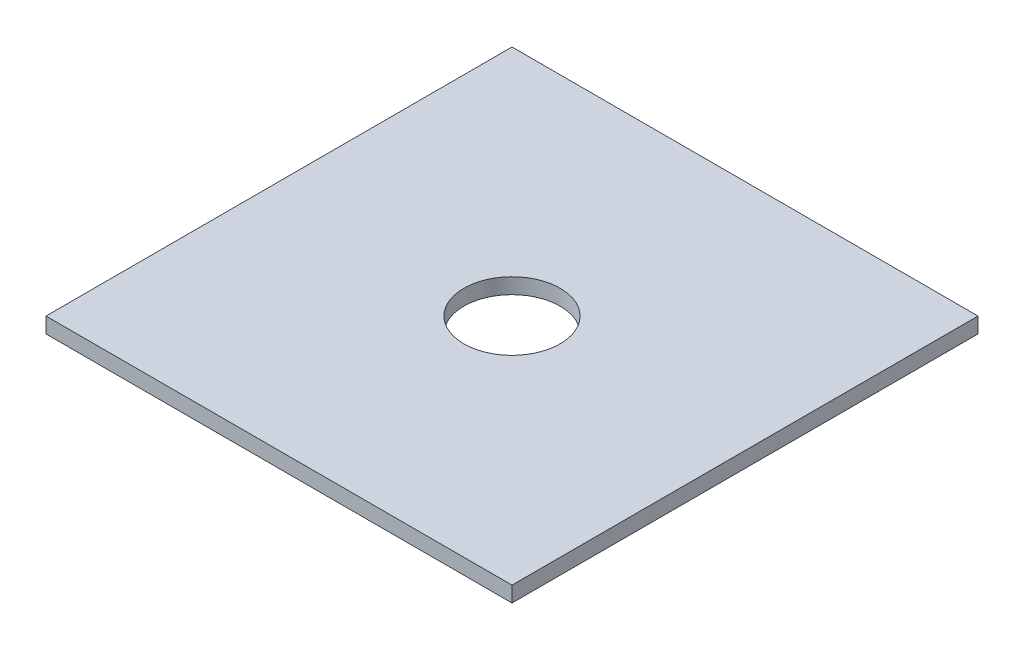
ISO-10303-21;
HEADER;
FILE_DESCRIPTION(('STEP AP214'),'2;1');
FILE_NAME('part.step','',(''),(''),'','','');
FILE_SCHEMA(('AUTOMOTIVE_DESIGN { 1 0 10303 214 1 1 1 1 }'));
ENDSEC;
DATA;
#1=APPLICATION_CONTEXT('core data for automotive mechanical design processes');
#2=APPLICATION_PROTOCOL_DEFINITION('international standard','automotive_design',2000,#1);
#3=PRODUCT_CONTEXT('',#1,'mechanical');
#4=PRODUCT('Part','Part','',(#3));
#5=PRODUCT_RELATED_PRODUCT_CATEGORY('part','',(#4));
#6=PRODUCT_DEFINITION_FORMATION('','',#4);
#7=PRODUCT_DEFINITION_CONTEXT('part definition',#1,'design');
#8=PRODUCT_DEFINITION('design','',#6,#7);
#9=PRODUCT_DEFINITION_SHAPE('','',#8);
#10=(LENGTH_UNIT() NAMED_UNIT(*) SI_UNIT(.MILLI.,.METRE.));
#11=(NAMED_UNIT(*) PLANE_ANGLE_UNIT() SI_UNIT($,.RADIAN.));
#12=(NAMED_UNIT(*) SI_UNIT($,.STERADIAN.) SOLID_ANGLE_UNIT());
#13=UNCERTAINTY_MEASURE_WITH_UNIT(LENGTH_MEASURE(1.E-05),#10,'distance_accuracy_value','');
#14=(GEOMETRIC_REPRESENTATION_CONTEXT(3) GLOBAL_UNCERTAINTY_ASSIGNED_CONTEXT((#13)) GLOBAL_UNIT_ASSIGNED_CONTEXT((#10,
#11,#12)) REPRESENTATION_CONTEXT('',''));
#15=CARTESIAN_POINT('',(0.,0.,0.));
#16=DIRECTION('',(0.,0.,1.));
#17=DIRECTION('',(1.,0.,0.));
#18=AXIS2_PLACEMENT_3D('',#15,#16,#17);
#19=CARTESIAN_POINT('',(15.,41.,-15.));
#20=DIRECTION('',(-1.,0.,0.));
#21=DIRECTION('',(0.,0.,1.));
#22=AXIS2_PLACEMENT_3D('',#19,#20,#21);
#23=PLANE('',#22);
#24=DIRECTION('',(0.,0.,-1.));
#25=VECTOR('',#24,1.);
#26=CARTESIAN_POINT('',(15.,40.,-15.));
#27=LINE('',#26,#25);
#28=CARTESIAN_POINT('',(15.,40.,15.));
#29=VERTEX_POINT('',#28);
#30=CARTESIAN_POINT('',(15.,40.,-15.));
#31=VERTEX_POINT('',#30);
#32=EDGE_CURVE('E96',#29,#31,#27,.T.);
#33=ORIENTED_EDGE('',*,*,#32,.T.);
#34=DIRECTION('',(0.,-1.,0.));
#35=VECTOR('',#34,1.);
#36=CARTESIAN_POINT('',(15.,41.,-15.));
#37=LINE('',#36,#35);
#38=CARTESIAN_POINT('',(15.,41.,-15.));
#39=VERTEX_POINT('',#38);
#40=EDGE_CURVE('E11',#39,#31,#37,.T.);
#41=ORIENTED_EDGE('',*,*,#40,.F.);
#42=DIRECTION('',(0.,0.,-1.));
#43=VECTOR('',#42,1.);
#44=CARTESIAN_POINT('',(15.,41.,-15.));
#45=LINE('',#44,#43);
#46=CARTESIAN_POINT('',(15.,41.,15.));
#47=VERTEX_POINT('',#46);
#48=EDGE_CURVE('E84',#47,#39,#45,.T.);
#49=ORIENTED_EDGE('',*,*,#48,.F.);
#50=DIRECTION('',(0.,-1.,0.));
#51=VECTOR('',#50,1.);
#52=CARTESIAN_POINT('',(15.,41.,15.));
#53=LINE('',#52,#51);
#54=EDGE_CURVE('E92',#47,#29,#53,.T.);
#55=ORIENTED_EDGE('',*,*,#54,.T.);
#56=EDGE_LOOP('',(#33,#41,#49,#55));
#57=FACE_BOUND('',#56,.T.);
#58=ADVANCED_FACE('F33',(#57),#23,.F.);
#59=CARTESIAN_POINT('',(-15.,41.,-15.));
#60=DIRECTION('',(0.,0.,1.));
#61=DIRECTION('',(1.,0.,0.));
#62=AXIS2_PLACEMENT_3D('',#59,#60,#61);
#63=PLANE('',#62);
#64=DIRECTION('',(-1.,0.,0.));
#65=VECTOR('',#64,1.);
#66=CARTESIAN_POINT('',(-15.,40.,-15.));
#67=LINE('',#66,#65);
#68=CARTESIAN_POINT('',(-15.,40.,-15.));
#69=VERTEX_POINT('',#68);
#70=EDGE_CURVE('E88',#31,#69,#67,.T.);
#71=ORIENTED_EDGE('',*,*,#70,.T.);
#72=DIRECTION('',(0.,-1.,0.));
#73=VECTOR('',#72,1.);
#74=CARTESIAN_POINT('',(-15.,41.,-15.));
#75=LINE('',#74,#73);
#76=CARTESIAN_POINT('',(-15.,41.,-15.));
#77=VERTEX_POINT('',#76);
#78=EDGE_CURVE('E41',#77,#69,#75,.T.);
#79=ORIENTED_EDGE('',*,*,#78,.F.);
#80=DIRECTION('',(-1.,0.,0.));
#81=VECTOR('',#80,1.);
#82=CARTESIAN_POINT('',(-15.,41.,-15.));
#83=LINE('',#82,#81);
#84=EDGE_CURVE('E79',#39,#77,#83,.T.);
#85=ORIENTED_EDGE('',*,*,#84,.F.);
#86=ORIENTED_EDGE('',*,*,#40,.T.);
#87=EDGE_LOOP('',(#71,#79,#85,#86));
#88=FACE_BOUND('',#87,.T.);
#89=ADVANCED_FACE('F87',(#88),#63,.F.);
#90=CARTESIAN_POINT('',(-15.,41.,-15.));
#91=DIRECTION('',(1.,0.,0.));
#92=DIRECTION('',(0.,0.,-1.));
#93=AXIS2_PLACEMENT_3D('',#90,#91,#92);
#94=PLANE('',#93);
#95=DIRECTION('',(0.,0.,1.));
#96=VECTOR('',#95,1.);
#97=CARTESIAN_POINT('',(-15.,40.,-15.));
#98=LINE('',#97,#96);
#99=CARTESIAN_POINT('',(-15.,40.,15.));
#100=VERTEX_POINT('',#99);
#101=EDGE_CURVE('E66',#69,#100,#98,.T.);
#102=ORIENTED_EDGE('',*,*,#101,.T.);
#103=DIRECTION('',(0.,-1.,0.));
#104=VECTOR('',#103,1.);
#105=CARTESIAN_POINT('',(-15.,41.,15.));
#106=LINE('',#105,#104);
#107=CARTESIAN_POINT('',(-15.,41.,15.));
#108=VERTEX_POINT('',#107);
#109=EDGE_CURVE('E89',#108,#100,#106,.T.);
#110=ORIENTED_EDGE('',*,*,#109,.F.);
#111=DIRECTION('',(0.,0.,1.));
#112=VECTOR('',#111,1.);
#113=CARTESIAN_POINT('',(-15.,41.,-15.));
#114=LINE('',#113,#112);
#115=EDGE_CURVE('E82',#77,#108,#114,.T.);
#116=ORIENTED_EDGE('',*,*,#115,.F.);
#117=ORIENTED_EDGE('',*,*,#78,.T.);
#118=EDGE_LOOP('',(#102,#110,#116,#117));
#119=FACE_BOUND('',#118,.T.);
#120=ADVANCED_FACE('F90',(#119),#94,.F.);
#121=CARTESIAN_POINT('',(-15.,41.,15.));
#122=DIRECTION('',(0.,0.,-1.));
#123=DIRECTION('',(-1.,0.,0.));
#124=AXIS2_PLACEMENT_3D('',#121,#122,#123);
#125=PLANE('',#124);
#126=DIRECTION('',(1.,0.,0.));
#127=VECTOR('',#126,1.);
#128=CARTESIAN_POINT('',(-15.,40.,15.));
#129=LINE('',#128,#127);
#130=EDGE_CURVE('E72',#100,#29,#129,.T.);
#131=ORIENTED_EDGE('',*,*,#130,.T.);
#132=ORIENTED_EDGE('',*,*,#54,.F.);
#133=DIRECTION('',(1.,0.,0.));
#134=VECTOR('',#133,1.);
#135=CARTESIAN_POINT('',(-15.,41.,15.));
#136=LINE('',#135,#134);
#137=EDGE_CURVE('E49',#108,#47,#136,.T.);
#138=ORIENTED_EDGE('',*,*,#137,.F.);
#139=ORIENTED_EDGE('',*,*,#109,.T.);
#140=EDGE_LOOP('',(#131,#132,#138,#139));
#141=FACE_BOUND('',#140,.T.);
#142=ADVANCED_FACE('F104',(#141),#125,.F.);
#143=CARTESIAN_POINT('',(0.,41.,0.));
#144=DIRECTION('',(0.,1.,0.));
#145=DIRECTION('',(0.,0.,1.));
#146=AXIS2_PLACEMENT_3D('',#143,#144,#145);
#147=PLANE('',#146);
#148=CARTESIAN_POINT('',(0.,41.,0.));
#149=DIRECTION('',(0.,1.,0.));
#150=DIRECTION('',(0.,0.,1.));
#151=AXIS2_PLACEMENT_3D('',#148,#149,#150);
#152=CIRCLE('',#151,3.1);
#153=CARTESIAN_POINT('',(0.,41.,3.1));
#154=VERTEX_POINT('',#153);
#155=EDGE_CURVE('E110',#154,#154,#152,.T.);
#156=ORIENTED_EDGE('',*,*,#155,.F.);
#157=EDGE_LOOP('',(#156));
#158=FACE_BOUND('',#157,.T.);
#159=ORIENTED_EDGE('',*,*,#48,.T.);
#160=ORIENTED_EDGE('',*,*,#84,.T.);
#161=ORIENTED_EDGE('',*,*,#115,.T.);
#162=ORIENTED_EDGE('',*,*,#137,.T.);
#163=EDGE_LOOP('',(#159,#160,#161,#162));
#164=FACE_BOUND('',#163,.T.);
#165=ADVANCED_FACE('F80',(#158,#164),#147,.T.);
#166=CARTESIAN_POINT('',(0.,40.,0.));
#167=DIRECTION('',(0.,1.,0.));
#168=DIRECTION('',(0.,0.,1.));
#169=AXIS2_PLACEMENT_3D('',#166,#167,#168);
#170=PLANE('',#169);
#171=CARTESIAN_POINT('',(0.,40.,0.));
#172=DIRECTION('',(0.,1.,0.));
#173=DIRECTION('',(0.,0.,1.));
#174=AXIS2_PLACEMENT_3D('',#171,#172,#173);
#175=CIRCLE('',#174,3.1);
#176=CARTESIAN_POINT('',(0.,40.,3.1));
#177=VERTEX_POINT('',#176);
#178=EDGE_CURVE('E99',#177,#177,#175,.T.);
#179=ORIENTED_EDGE('',*,*,#178,.T.);
#180=EDGE_LOOP('',(#179));
#181=FACE_BOUND('',#180,.T.);
#182=ORIENTED_EDGE('',*,*,#32,.F.);
#183=ORIENTED_EDGE('',*,*,#130,.F.);
#184=ORIENTED_EDGE('',*,*,#101,.F.);
#185=ORIENTED_EDGE('',*,*,#70,.F.);
#186=EDGE_LOOP('',(#182,#183,#184,#185));
#187=FACE_BOUND('',#186,.T.);
#188=ADVANCED_FACE('F107',(#181,#187),#170,.F.);
#189=CARTESIAN_POINT('',(0.,40.,0.));
#190=DIRECTION('',(0.,1.,0.));
#191=DIRECTION('',(0.,0.,1.));
#192=AXIS2_PLACEMENT_3D('',#189,#190,#191);
#193=CYLINDRICAL_SURFACE('',#192,3.1);
#194=ORIENTED_EDGE('',*,*,#178,.F.);
#195=EDGE_LOOP('',(#194));
#196=FACE_BOUND('',#195,.T.);
#197=ORIENTED_EDGE('',*,*,#155,.T.);
#198=EDGE_LOOP('',(#197));
#199=FACE_BOUND('',#198,.T.);
#200=ADVANCED_FACE('F117',(#196,#199),#193,.F.);
#201=CLOSED_SHELL('',(#58,#89,#120,#142,#165,#188,#200));
#202=MANIFOLD_SOLID_BREP('B2',#201);
#203=ADVANCED_BREP_SHAPE_REPRESENTATION('',(#18,#202),#14);
#204=SHAPE_DEFINITION_REPRESENTATION(#9,#203);
ENDSEC;
END-ISO-10303-21;
